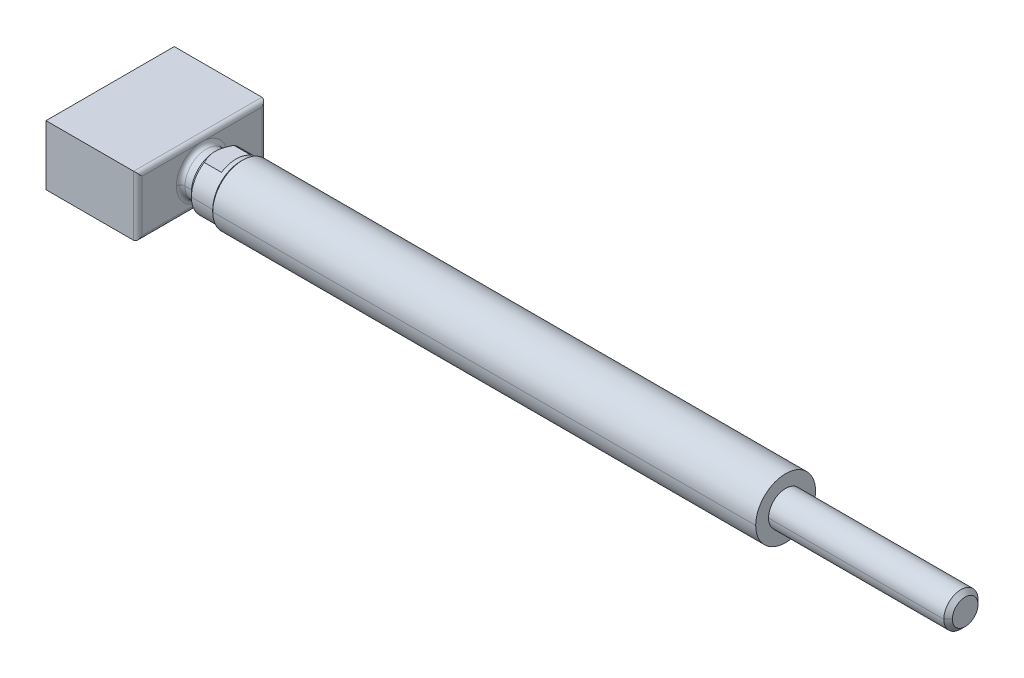
ISO-10303-21;
HEADER;
FILE_DESCRIPTION(('STEP AP214'),'2;1');
FILE_NAME('part.step','',(''),(''),'','','');
FILE_SCHEMA(('AUTOMOTIVE_DESIGN { 1 0 10303 214 1 1 1 1 }'));
ENDSEC;
DATA;
#1=APPLICATION_CONTEXT('core data for automotive mechanical design processes');
#2=APPLICATION_PROTOCOL_DEFINITION('international standard','automotive_design',2000,#1);
#3=PRODUCT_CONTEXT('',#1,'mechanical');
#4=PRODUCT('Part','Part','',(#3));
#5=PRODUCT_RELATED_PRODUCT_CATEGORY('part','',(#4));
#6=PRODUCT_DEFINITION_FORMATION('','',#4);
#7=PRODUCT_DEFINITION_CONTEXT('part definition',#1,'design');
#8=PRODUCT_DEFINITION('design','',#6,#7);
#9=PRODUCT_DEFINITION_SHAPE('','',#8);
#10=(LENGTH_UNIT() NAMED_UNIT(*) SI_UNIT(.MILLI.,.METRE.));
#11=(NAMED_UNIT(*) PLANE_ANGLE_UNIT() SI_UNIT($,.RADIAN.));
#12=(NAMED_UNIT(*) SI_UNIT($,.STERADIAN.) SOLID_ANGLE_UNIT());
#13=UNCERTAINTY_MEASURE_WITH_UNIT(LENGTH_MEASURE(1.E-05),#10,'distance_accuracy_value','');
#14=(GEOMETRIC_REPRESENTATION_CONTEXT(3) GLOBAL_UNCERTAINTY_ASSIGNED_CONTEXT((#13)) GLOBAL_UNIT_ASSIGNED_CONTEXT((#10,
#11,#12)) REPRESENTATION_CONTEXT('',''));
#15=CARTESIAN_POINT('',(0.,0.,0.));
#16=DIRECTION('',(0.,0.,1.));
#17=DIRECTION('',(1.,0.,0.));
#18=AXIS2_PLACEMENT_3D('',#15,#16,#17);
#19=CARTESIAN_POINT('',(-77.5,0.,0.));
#20=DIRECTION('',(-1.,0.,0.));
#21=DIRECTION('',(0.,0.,1.));
#22=AXIS2_PLACEMENT_3D('',#19,#20,#21);
#23=TOROIDAL_SURFACE('',#22,6.,1.);
#24=CARTESIAN_POINT('',(-78.5,0.,0.));
#25=DIRECTION('',(-1.,0.,0.));
#26=DIRECTION('',(0.,0.,1.));
#27=AXIS2_PLACEMENT_3D('',#24,#25,#26);
#28=CIRCLE('',#27,6.);
#29=CARTESIAN_POINT('',(-78.5,0.,-6.));
#30=VERTEX_POINT('',#29);
#31=CARTESIAN_POINT('',(-78.5,-6.,0.));
#32=VERTEX_POINT('',#31);
#33=EDGE_CURVE('E538',#30,#32,#28,.T.);
#34=ORIENTED_EDGE('',*,*,#33,.F.);
#35=CARTESIAN_POINT('',(-77.5,0.,-6.));
#36=DIRECTION('',(0.,1.,0.));
#37=DIRECTION('',(0.,0.,1.));
#38=AXIS2_PLACEMENT_3D('',#35,#36,#37);
#39=CIRCLE('',#38,1.);
#40=CARTESIAN_POINT('',(-77.5,0.,-5.));
#41=VERTEX_POINT('',#40);
#42=EDGE_CURVE('E550',#30,#41,#39,.T.);
#43=ORIENTED_EDGE('',*,*,#42,.T.);
#44=CARTESIAN_POINT('',(-77.5,0.,0.));
#45=DIRECTION('',(1.,0.,0.));
#46=DIRECTION('',(0.,0.,1.));
#47=AXIS2_PLACEMENT_3D('',#44,#45,#46);
#48=CIRCLE('',#47,5.);
#49=CARTESIAN_POINT('',(-77.5,0.,5.));
#50=VERTEX_POINT('',#49);
#51=EDGE_CURVE('E440',#50,#41,#48,.T.);
#52=ORIENTED_EDGE('',*,*,#51,.F.);
#53=CARTESIAN_POINT('',(-77.5,0.,6.));
#54=DIRECTION('',(0.,-1.,0.));
#55=DIRECTION('',(0.,0.,-1.));
#56=AXIS2_PLACEMENT_3D('',#53,#54,#55);
#57=CIRCLE('',#56,1.);
#58=CARTESIAN_POINT('',(-78.5,0.,6.));
#59=VERTEX_POINT('',#58);
#60=EDGE_CURVE('E421',#59,#50,#57,.T.);
#61=ORIENTED_EDGE('',*,*,#60,.F.);
#62=CARTESIAN_POINT('',(-78.5,0.,0.));
#63=DIRECTION('',(-1.,0.,0.));
#64=DIRECTION('',(0.,0.,1.));
#65=AXIS2_PLACEMENT_3D('',#62,#63,#64);
#66=CIRCLE('',#65,6.);
#67=EDGE_CURVE('E486',#32,#59,#66,.T.);
#68=ORIENTED_EDGE('',*,*,#67,.F.);
#69=EDGE_LOOP('',(#34,#43,#52,#61,#68));
#70=FACE_BOUND('',#69,.T.);
#71=ADVANCED_FACE('F16',(#70),#23,.F.);
#72=CARTESIAN_POINT('',(-100.,0.,0.));
#73=DIRECTION('',(-1.,0.,0.));
#74=DIRECTION('',(0.,0.,1.));
#75=AXIS2_PLACEMENT_3D('',#72,#73,#74);
#76=CYLINDRICAL_SURFACE('',#75,5.);
#77=CARTESIAN_POINT('',(-75.5,0.,0.));
#78=DIRECTION('',(-1.,0.,0.));
#79=DIRECTION('',(0.,0.,1.));
#80=AXIS2_PLACEMENT_3D('',#77,#78,#79);
#81=CIRCLE('',#80,5.);
#82=CARTESIAN_POINT('',(-75.5,0.,5.));
#83=VERTEX_POINT('',#82);
#84=CARTESIAN_POINT('',(-75.5,0.,-5.));
#85=VERTEX_POINT('',#84);
#86=EDGE_CURVE('E220',#83,#85,#81,.T.);
#87=ORIENTED_EDGE('',*,*,#86,.T.);
#88=DIRECTION('',(-1.,0.,0.));
#89=VECTOR('',#88,1.);
#90=CARTESIAN_POINT('',(-100.,0.,-5.));
#91=LINE('',#90,#89);
#92=EDGE_CURVE('E516',#85,#41,#91,.T.);
#93=ORIENTED_EDGE('',*,*,#92,.T.);
#94=CARTESIAN_POINT('',(-77.5,0.,0.));
#95=DIRECTION('',(1.,0.,0.));
#96=DIRECTION('',(0.,0.,1.));
#97=AXIS2_PLACEMENT_3D('',#94,#95,#96);
#98=CIRCLE('',#97,5.);
#99=EDGE_CURVE('E460',#41,#50,#98,.T.);
#100=ORIENTED_EDGE('',*,*,#99,.T.);
#101=DIRECTION('',(-1.,0.,0.));
#102=VECTOR('',#101,1.);
#103=CARTESIAN_POINT('',(-100.,0.,5.));
#104=LINE('',#103,#102);
#105=EDGE_CURVE('E444',#83,#50,#104,.T.);
#106=ORIENTED_EDGE('',*,*,#105,.F.);
#107=EDGE_LOOP('',(#87,#93,#100,#106));
#108=FACE_BOUND('',#107,.T.);
#109=ADVANCED_FACE('F327',(#108),#76,.T.);
#110=CARTESIAN_POINT('',(-100.,0.,0.));
#111=DIRECTION('',(-1.,0.,0.));
#112=DIRECTION('',(0.,0.,1.));
#113=AXIS2_PLACEMENT_3D('',#110,#111,#112);
#114=CYLINDRICAL_SURFACE('',#113,6.5);
#115=CARTESIAN_POINT('',(-69.5,0.,0.));
#116=DIRECTION('',(-1.,0.,0.));
#117=DIRECTION('',(0.,0.,1.));
#118=AXIS2_PLACEMENT_3D('',#115,#116,#117);
#119=CIRCLE('',#118,6.5);
#120=CARTESIAN_POINT('',(-69.5,0.,6.5));
#121=VERTEX_POINT('',#120);
#122=CARTESIAN_POINT('',(-69.5,0.,-6.5));
#123=VERTEX_POINT('',#122);
#124=EDGE_CURVE('E11',#121,#123,#119,.T.);
#125=ORIENTED_EDGE('',*,*,#124,.T.);
#126=DIRECTION('',(-1.,0.,0.));
#127=VECTOR('',#126,1.);
#128=CARTESIAN_POINT('',(-100.,0.,-6.5));
#129=LINE('',#128,#127);
#130=CARTESIAN_POINT('',(-74.5,0.,-6.5));
#131=VERTEX_POINT('',#130);
#132=EDGE_CURVE('E499',#123,#131,#129,.T.);
#133=ORIENTED_EDGE('',*,*,#132,.T.);
#134=CARTESIAN_POINT('',(-74.5,0.,0.));
#135=DIRECTION('',(-1.,0.,0.));
#136=DIRECTION('',(0.,0.,1.));
#137=AXIS2_PLACEMENT_3D('',#134,#135,#136);
#138=CIRCLE('',#137,6.5);
#139=CARTESIAN_POINT('',(-74.5,5.5,-3.46410161513775));
#140=VERTEX_POINT('',#139);
#141=EDGE_CURVE('E541',#140,#131,#138,.T.);
#142=ORIENTED_EDGE('',*,*,#141,.F.);
#143=DIRECTION('',(1.,0.,0.));
#144=VECTOR('',#143,1.);
#145=CARTESIAN_POINT('',(-100.,5.5,-3.46410161513775));
#146=LINE('',#145,#144);
#147=CARTESIAN_POINT('',(-70.5,5.5,-3.46410161513775));
#148=VERTEX_POINT('',#147);
#149=EDGE_CURVE('E573',#140,#148,#146,.T.);
#150=ORIENTED_EDGE('',*,*,#149,.T.);
#151=CARTESIAN_POINT('',(-70.5,0.,0.));
#152=DIRECTION('',(1.,0.,0.));
#153=DIRECTION('',(0.,0.,-1.));
#154=AXIS2_PLACEMENT_3D('',#151,#152,#153);
#155=CIRCLE('',#154,6.5);
#156=CARTESIAN_POINT('',(-70.5,5.5,3.46410161513775));
#157=VERTEX_POINT('',#156);
#158=EDGE_CURVE('E483',#148,#157,#155,.T.);
#159=ORIENTED_EDGE('',*,*,#158,.T.);
#160=DIRECTION('',(-1.,0.,0.));
#161=VECTOR('',#160,1.);
#162=CARTESIAN_POINT('',(-100.,5.5,3.46410161513775));
#163=LINE('',#162,#161);
#164=CARTESIAN_POINT('',(-74.5,5.5,3.46410161513775));
#165=VERTEX_POINT('',#164);
#166=EDGE_CURVE('E250',#157,#165,#163,.T.);
#167=ORIENTED_EDGE('',*,*,#166,.T.);
#168=CARTESIAN_POINT('',(-74.5,0.,0.));
#169=DIRECTION('',(-1.,0.,0.));
#170=DIRECTION('',(0.,0.,1.));
#171=AXIS2_PLACEMENT_3D('',#168,#169,#170);
#172=CIRCLE('',#171,6.5);
#173=CARTESIAN_POINT('',(-74.5,0.,6.5));
#174=VERTEX_POINT('',#173);
#175=EDGE_CURVE('E219',#174,#165,#172,.T.);
#176=ORIENTED_EDGE('',*,*,#175,.F.);
#177=DIRECTION('',(-1.,0.,0.));
#178=VECTOR('',#177,1.);
#179=CARTESIAN_POINT('',(-100.,0.,6.5));
#180=LINE('',#179,#178);
#181=EDGE_CURVE('E216',#121,#174,#180,.T.);
#182=ORIENTED_EDGE('',*,*,#181,.F.);
#183=EDGE_LOOP('',(#125,#133,#142,#150,#159,#167,#176,#182));
#184=FACE_BOUND('',#183,.T.);
#185=ADVANCED_FACE('F323',(#184),#114,.T.);
#186=CARTESIAN_POINT('',(-69.,0.,0.));
#187=DIRECTION('',(1.,0.,0.));
#188=DIRECTION('',(0.,0.,-1.));
#189=AXIS2_PLACEMENT_3D('',#186,#187,#188);
#190=CONICAL_SURFACE('',#189,7.,0.785398163397446);
#191=ORIENTED_EDGE('',*,*,#124,.F.);
#192=DIRECTION('',(0.707106781186549,0.,0.707106781186546));
#193=VECTOR('',#192,1.);
#194=CARTESIAN_POINT('',(-69.,0.,7.));
#195=LINE('',#194,#193);
#196=CARTESIAN_POINT('',(-69.,0.,7.));
#197=VERTEX_POINT('',#196);
#198=EDGE_CURVE('E454',#121,#197,#195,.T.);
#199=ORIENTED_EDGE('',*,*,#198,.T.);
#200=CARTESIAN_POINT('',(-69.,0.,0.));
#201=DIRECTION('',(-1.,0.,0.));
#202=DIRECTION('',(0.,0.,1.));
#203=AXIS2_PLACEMENT_3D('',#200,#201,#202);
#204=CIRCLE('',#203,7.);
#205=CARTESIAN_POINT('',(-69.,0.,-7.));
#206=VERTEX_POINT('',#205);
#207=EDGE_CURVE('E33',#197,#206,#204,.T.);
#208=ORIENTED_EDGE('',*,*,#207,.T.);
#209=DIRECTION('',(0.707106781186549,0.,-0.707106781186546));
#210=VECTOR('',#209,1.);
#211=CARTESIAN_POINT('',(-69.,0.,-7.));
#212=LINE('',#211,#210);
#213=EDGE_CURVE('E449',#123,#206,#212,.T.);
#214=ORIENTED_EDGE('',*,*,#213,.F.);
#215=EDGE_LOOP('',(#191,#199,#208,#214));
#216=FACE_BOUND('',#215,.T.);
#217=ADVANCED_FACE('F326',(#216),#190,.T.);
#218=CARTESIAN_POINT('',(-100.,0.,0.));
#219=DIRECTION('',(-1.,0.,0.));
#220=DIRECTION('',(0.,0.,1.));
#221=AXIS2_PLACEMENT_3D('',#218,#219,#220);
#222=CYLINDRICAL_SURFACE('',#221,7.);
#223=CARTESIAN_POINT('',(58.,0.,0.));
#224=DIRECTION('',(-1.,0.,0.));
#225=DIRECTION('',(0.,0.,1.));
#226=AXIS2_PLACEMENT_3D('',#223,#224,#225);
#227=CIRCLE('',#226,7.);
#228=CARTESIAN_POINT('',(58.,0.,7.));
#229=VERTEX_POINT('',#228);
#230=CARTESIAN_POINT('',(58.,0.,-7.));
#231=VERTEX_POINT('',#230);
#232=EDGE_CURVE('E528',#229,#231,#227,.T.);
#233=ORIENTED_EDGE('',*,*,#232,.T.);
#234=DIRECTION('',(-1.,0.,0.));
#235=VECTOR('',#234,1.);
#236=CARTESIAN_POINT('',(-100.,0.,-7.));
#237=LINE('',#236,#235);
#238=EDGE_CURVE('E542',#231,#206,#237,.T.);
#239=ORIENTED_EDGE('',*,*,#238,.T.);
#240=ORIENTED_EDGE('',*,*,#207,.F.);
#241=DIRECTION('',(-1.,0.,0.));
#242=VECTOR('',#241,1.);
#243=CARTESIAN_POINT('',(-100.,0.,7.));
#244=LINE('',#243,#242);
#245=EDGE_CURVE('E524',#229,#197,#244,.T.);
#246=ORIENTED_EDGE('',*,*,#245,.F.);
#247=EDGE_LOOP('',(#233,#239,#240,#246));
#248=FACE_BOUND('',#247,.T.);
#249=ADVANCED_FACE('F317',(#248),#222,.T.);
#250=CARTESIAN_POINT('',(-100.,0.,0.));
#251=DIRECTION('',(-1.,0.,0.));
#252=DIRECTION('',(0.,0.,1.));
#253=AXIS2_PLACEMENT_3D('',#250,#251,#252);
#254=CYLINDRICAL_SURFACE('',#253,4.);
#255=CARTESIAN_POINT('',(99.,0.,0.));
#256=DIRECTION('',(-1.,0.,0.));
#257=DIRECTION('',(0.,0.,1.));
#258=AXIS2_PLACEMENT_3D('',#255,#256,#257);
#259=CIRCLE('',#258,4.);
#260=CARTESIAN_POINT('',(99.,0.,4.));
#261=VERTEX_POINT('',#260);
#262=CARTESIAN_POINT('',(99.,0.,-4.));
#263=VERTEX_POINT('',#262);
#264=EDGE_CURVE('E476',#261,#263,#259,.T.);
#265=ORIENTED_EDGE('',*,*,#264,.T.);
#266=DIRECTION('',(-1.,0.,0.));
#267=VECTOR('',#266,1.);
#268=CARTESIAN_POINT('',(-100.,0.,-4.));
#269=LINE('',#268,#267);
#270=CARTESIAN_POINT('',(58.,0.,-4.));
#271=VERTEX_POINT('',#270);
#272=EDGE_CURVE('E472',#263,#271,#269,.T.);
#273=ORIENTED_EDGE('',*,*,#272,.T.);
#274=CARTESIAN_POINT('',(58.,0.,0.));
#275=DIRECTION('',(-1.,0.,0.));
#276=DIRECTION('',(0.,0.,1.));
#277=AXIS2_PLACEMENT_3D('',#274,#275,#276);
#278=CIRCLE('',#277,4.);
#279=CARTESIAN_POINT('',(58.,0.,4.));
#280=VERTEX_POINT('',#279);
#281=EDGE_CURVE('E534',#280,#271,#278,.T.);
#282=ORIENTED_EDGE('',*,*,#281,.F.);
#283=DIRECTION('',(-1.,0.,0.));
#284=VECTOR('',#283,1.);
#285=CARTESIAN_POINT('',(-100.,0.,4.));
#286=LINE('',#285,#284);
#287=EDGE_CURVE('E471',#261,#280,#286,.T.);
#288=ORIENTED_EDGE('',*,*,#287,.F.);
#289=EDGE_LOOP('',(#265,#273,#282,#288));
#290=FACE_BOUND('',#289,.T.);
#291=ADVANCED_FACE('F269',(#290),#254,.T.);
#292=CARTESIAN_POINT('',(100.,0.,0.));
#293=DIRECTION('',(-1.,0.,0.));
#294=DIRECTION('',(0.,0.,1.));
#295=AXIS2_PLACEMENT_3D('',#292,#293,#294);
#296=CONICAL_SURFACE('',#295,3.,0.785398163397448);
#297=CARTESIAN_POINT('',(100.,0.,0.));
#298=DIRECTION('',(-1.,0.,0.));
#299=DIRECTION('',(0.,0.,1.));
#300=AXIS2_PLACEMENT_3D('',#297,#298,#299);
#301=CIRCLE('',#300,3.);
#302=CARTESIAN_POINT('',(100.,0.,3.));
#303=VERTEX_POINT('',#302);
#304=CARTESIAN_POINT('',(100.,0.,-3.));
#305=VERTEX_POINT('',#304);
#306=EDGE_CURVE('E47',#303,#305,#301,.T.);
#307=ORIENTED_EDGE('',*,*,#306,.T.);
#308=DIRECTION('',(-0.707106781186548,0.,-0.707106781186547));
#309=VECTOR('',#308,1.);
#310=CARTESIAN_POINT('',(100.,0.,-3.));
#311=LINE('',#310,#309);
#312=EDGE_CURVE('E549',#305,#263,#311,.T.);
#313=ORIENTED_EDGE('',*,*,#312,.T.);
#314=ORIENTED_EDGE('',*,*,#264,.F.);
#315=DIRECTION('',(-0.707106781186548,0.,0.707106781186547));
#316=VECTOR('',#315,1.);
#317=CARTESIAN_POINT('',(100.,0.,3.));
#318=LINE('',#317,#316);
#319=EDGE_CURVE('E502',#303,#261,#318,.T.);
#320=ORIENTED_EDGE('',*,*,#319,.F.);
#321=EDGE_LOOP('',(#307,#313,#314,#320));
#322=FACE_BOUND('',#321,.T.);
#323=ADVANCED_FACE('F264',(#322),#296,.T.);
#324=CARTESIAN_POINT('',(-74.5,0.,0.));
#325=DIRECTION('',(1.,0.,0.));
#326=DIRECTION('',(0.,0.,-1.));
#327=AXIS2_PLACEMENT_3D('',#324,#325,#326);
#328=CONICAL_SURFACE('',#327,6.5,0.785398163397448);
#329=CARTESIAN_POINT('',(-75.5,0.,0.));
#330=DIRECTION('',(-1.,0.,0.));
#331=DIRECTION('',(0.,0.,1.));
#332=AXIS2_PLACEMENT_3D('',#329,#330,#331);
#333=CIRCLE('',#332,5.5);
#334=CARTESIAN_POINT('',(-75.5,0.,-5.5));
#335=VERTEX_POINT('',#334);
#336=CARTESIAN_POINT('',(-75.5,-5.5,0.));
#337=VERTEX_POINT('',#336);
#338=EDGE_CURVE('E566',#335,#337,#333,.T.);
#339=ORIENTED_EDGE('',*,*,#338,.F.);
#340=DIRECTION('',(0.707106781186548,0.,-0.707106781186547));
#341=VECTOR('',#340,1.);
#342=CARTESIAN_POINT('',(-74.5,0.,-6.5));
#343=LINE('',#342,#341);
#344=EDGE_CURVE('E511',#335,#131,#343,.T.);
#345=ORIENTED_EDGE('',*,*,#344,.T.);
#346=CARTESIAN_POINT('',(-74.5,0.,0.));
#347=DIRECTION('',(-1.,0.,0.));
#348=DIRECTION('',(0.,0.,1.));
#349=AXIS2_PLACEMENT_3D('',#346,#347,#348);
#350=CIRCLE('',#349,6.5);
#351=CARTESIAN_POINT('',(-74.5,-5.5,-3.46410161513775));
#352=VERTEX_POINT('',#351);
#353=EDGE_CURVE('E447',#131,#352,#350,.T.);
#354=ORIENTED_EDGE('',*,*,#353,.T.);
#355=CARTESIAN_POINT('',(-74.5,-5.5,-3.46410161513775));
#356=CARTESIAN_POINT('',(-74.5520670063043,-5.5,-3.36639231048485));
#357=CARTESIAN_POINT('',(-74.602914573613,-5.5,-3.26803477504346));
#358=CARTESIAN_POINT('',(-74.7018354319516,-5.5,-3.06989646737792));
#359=CARTESIAN_POINT('',(-74.7499078198237,-5.5,-2.97011524485662));
#360=CARTESIAN_POINT('',(-74.8897889742277,-5.5,-2.66772032538694));
#361=CARTESIAN_POINT('',(-74.9768305432994,-5.5,-2.46285195615751));
#362=CARTESIAN_POINT('',(-75.1326212757393,-5.5,-2.05214101589369));
#363=CARTESIAN_POINT('',(-75.2017787338366,-5.5,-1.84645521756863));
#364=CARTESIAN_POINT('',(-75.3206703988509,-5.5,-1.4298497791996));
#365=CARTESIAN_POINT('',(-75.3704425313218,-5.5,-1.21894122602478));
#366=CARTESIAN_POINT('',(-75.4384694427188,-5.5,-0.840833175891037));
#367=CARTESIAN_POINT('',(-75.4612936697113,-5.5,-0.674463828044059));
#368=CARTESIAN_POINT('',(-75.4843908290548,-5.5,-0.423098145503098));
#369=CARTESIAN_POINT('',(-75.4902341434836,-5.5,-0.338591444805933));
#370=CARTESIAN_POINT('',(-75.4980426172977,-5.5,-0.169393495526894));
#371=CARTESIAN_POINT('',(-75.5000075013453,-5.5,-0.0847022342699308));
#372=CARTESIAN_POINT('',(-75.5,-5.5,0.));
#373=B_SPLINE_CURVE_WITH_KNOTS('',3,(#355,#356,#357,#358,#359,#360,#361,#362,#363,#364,#365,
#366,#367,#368,#369,#370,#371,#372),.UNSPECIFIED.,.F.,.F.,(4,2,2,2,2,2,2,2,4),(0.,
0.332131746596437,0.664370980166019,1.33156261056564,1.98181606925445,2.6307909005797,
3.13390574239053,3.38795081114665,3.6420139144342),.UNSPECIFIED.);
#374=EDGE_CURVE('E227',#352,#337,#373,.T.);
#375=ORIENTED_EDGE('',*,*,#374,.T.);
#376=EDGE_LOOP('',(#339,#345,#354,#375));
#377=FACE_BOUND('',#376,.T.);
#378=ADVANCED_FACE('F268',(#377),#328,.T.);
#379=CARTESIAN_POINT('',(-78.5,5.,0.));
#380=DIRECTION('',(-1.,0.,0.));
#381=DIRECTION('',(0.,0.,1.));
#382=AXIS2_PLACEMENT_3D('',#379,#380,#381);
#383=PLANE('',#382);
#384=DIRECTION('',(0.,1.,0.));
#385=VECTOR('',#384,1.);
#386=CARTESIAN_POINT('',(-78.5,7.,-14.));
#387=LINE('',#386,#385);
#388=CARTESIAN_POINT('',(-78.5,-6.,-14.));
#389=VERTEX_POINT('',#388);
#390=CARTESIAN_POINT('',(-78.5,6.,-14.));
#391=VERTEX_POINT('',#390);
#392=EDGE_CURVE('E482',#389,#391,#387,.T.);
#393=ORIENTED_EDGE('',*,*,#392,.T.);
#394=DIRECTION('',(0.,0.,1.));
#395=VECTOR('',#394,1.);
#396=CARTESIAN_POINT('',(-78.5,6.,15.));
#397=LINE('',#396,#395);
#398=CARTESIAN_POINT('',(-78.5,6.,0.));
#399=VERTEX_POINT('',#398);
#400=EDGE_CURVE('E409',#391,#399,#397,.T.);
#401=ORIENTED_EDGE('',*,*,#400,.T.);
#402=CARTESIAN_POINT('',(-78.5,0.,0.));
#403=DIRECTION('',(-1.,0.,0.));
#404=DIRECTION('',(0.,0.,1.));
#405=AXIS2_PLACEMENT_3D('',#402,#403,#404);
#406=CIRCLE('',#405,6.);
#407=EDGE_CURVE('E554',#399,#30,#406,.T.);
#408=ORIENTED_EDGE('',*,*,#407,.T.);
#409=ORIENTED_EDGE('',*,*,#33,.T.);
#410=DIRECTION('',(0.,0.,-1.));
#411=VECTOR('',#410,1.);
#412=CARTESIAN_POINT('',(-78.5,-6.,-15.));
#413=LINE('',#412,#411);
#414=EDGE_CURVE('E481',#32,#389,#413,.T.);
#415=ORIENTED_EDGE('',*,*,#414,.T.);
#416=EDGE_LOOP('',(#393,#401,#408,#409,#415));
#417=FACE_BOUND('',#416,.T.);
#418=ADVANCED_FACE('F347',(#417),#383,.F.);
#419=CARTESIAN_POINT('',(-74.5,0.,0.));
#420=DIRECTION('',(1.,0.,0.));
#421=DIRECTION('',(0.,0.,-1.));
#422=AXIS2_PLACEMENT_3D('',#419,#420,#421);
#423=CONICAL_SURFACE('',#422,6.5,0.785398163397448);
#424=ORIENTED_EDGE('',*,*,#344,.F.);
#425=CARTESIAN_POINT('',(-75.5,0.,0.));
#426=DIRECTION('',(-1.,0.,0.));
#427=DIRECTION('',(0.,0.,1.));
#428=AXIS2_PLACEMENT_3D('',#425,#426,#427);
#429=CIRCLE('',#428,5.5);
#430=CARTESIAN_POINT('',(-75.5,5.5,0.));
#431=VERTEX_POINT('',#430);
#432=EDGE_CURVE('E443',#431,#335,#429,.T.);
#433=ORIENTED_EDGE('',*,*,#432,.F.);
#434=CARTESIAN_POINT('',(-75.5,5.5,0.));
#435=CARTESIAN_POINT('',(-75.5000067814901,5.5,-0.0845024363328521));
#436=CARTESIAN_POINT('',(-75.4980515717066,5.5,-0.168992270115319));
#437=CARTESIAN_POINT('',(-75.4902810080754,5.5,-0.337781227576544));
#438=CARTESIAN_POINT('',(-75.4844662670954,5.5,-0.422080379402131));
#439=CARTESIAN_POINT('',(-75.4613590225216,5.5,-0.674140359222897));
#440=CARTESIAN_POINT('',(-75.438402974733,5.5,-0.841409941455972));
#441=CARTESIAN_POINT('',(-75.3790706584935,5.5,-1.17077816997709));
#442=CARTESIAN_POINT('',(-75.342910391959,5.5,-1.33291677161127));
#443=CARTESIAN_POINT('',(-75.2587383984197,5.5,-1.6541236229531));
#444=CARTESIAN_POINT('',(-75.2107223195704,5.5,-1.81319072205356));
#445=CARTESIAN_POINT('',(-75.1144252279604,5.5,-2.0987049839779));
#446=CARTESIAN_POINT('',(-75.067842705042,5.5,-2.22573383883002));
#447=CARTESIAN_POINT('',(-74.9688676200951,5.5,-2.47748844482364));
#448=CARTESIAN_POINT('',(-74.9164755156495,5.5,-2.60221437645002));
#449=CARTESIAN_POINT('',(-74.8059583536269,5.5,-2.85109955016192));
#450=CARTESIAN_POINT('',(-74.7477655516056,5.5,-2.97522850343496));
#451=CARTESIAN_POINT('',(-74.6269952594492,5.5,-3.22127572386168));
#452=CARTESIAN_POINT('',(-74.5644195932319,5.5,-3.34319488433789));
#453=CARTESIAN_POINT('',(-74.5,5.5,-3.46410161513775));
#454=B_SPLINE_CURVE_WITH_KNOTS('',3,(#434,#435,#436,#437,#438,#439,#440,#441,#442,#443,#444,
#445,#446,#447,#448,#449,#450,#451,#452,#453),.UNSPECIFIED.,.F.,.F.,(4,2,2,2,2,2,2,2,2,4),(0.,
0.253460599446802,0.506880960669017,1.01268690060144,1.51056434932942,2.00862482344103,
2.41437502517772,2.82009329128062,3.23127917720927,3.6422949543544),.UNSPECIFIED.);
#455=EDGE_CURVE('E251',#431,#140,#454,.T.);
#456=ORIENTED_EDGE('',*,*,#455,.T.);
#457=ORIENTED_EDGE('',*,*,#141,.T.);
#458=EDGE_LOOP('',(#424,#433,#456,#457));
#459=FACE_BOUND('',#458,.T.);
#460=ADVANCED_FACE('F275',(#459),#423,.T.);
#461=CARTESIAN_POINT('',(100.,0.,0.));
#462=DIRECTION('',(-1.,0.,0.));
#463=DIRECTION('',(0.,0.,1.));
#464=AXIS2_PLACEMENT_3D('',#461,#462,#463);
#465=PLANE('',#464);
#466=ORIENTED_EDGE('',*,*,#306,.F.);
#467=CARTESIAN_POINT('',(100.,0.,0.));
#468=DIRECTION('',(-1.,0.,0.));
#469=DIRECTION('',(0.,0.,1.));
#470=AXIS2_PLACEMENT_3D('',#467,#468,#469);
#471=CIRCLE('',#470,3.);
#472=EDGE_CURVE('E506',#305,#303,#471,.T.);
#473=ORIENTED_EDGE('',*,*,#472,.F.);
#474=EDGE_LOOP('',(#466,#473));
#475=FACE_BOUND('',#474,.T.);
#476=ADVANCED_FACE('F271',(#475),#465,.F.);
#477=CARTESIAN_POINT('',(100.,0.,0.));
#478=DIRECTION('',(-1.,0.,0.));
#479=DIRECTION('',(0.,0.,1.));
#480=AXIS2_PLACEMENT_3D('',#477,#478,#479);
#481=CONICAL_SURFACE('',#480,3.,0.785398163397448);
#482=ORIENTED_EDGE('',*,*,#312,.F.);
#483=ORIENTED_EDGE('',*,*,#472,.T.);
#484=ORIENTED_EDGE('',*,*,#319,.T.);
#485=CARTESIAN_POINT('',(99.,0.,0.));
#486=DIRECTION('',(-1.,0.,0.));
#487=DIRECTION('',(0.,0.,1.));
#488=AXIS2_PLACEMENT_3D('',#485,#486,#487);
#489=CIRCLE('',#488,4.);
#490=EDGE_CURVE('E467',#263,#261,#489,.T.);
#491=ORIENTED_EDGE('',*,*,#490,.F.);
#492=EDGE_LOOP('',(#482,#483,#484,#491));
#493=FACE_BOUND('',#492,.T.);
#494=ADVANCED_FACE('F274',(#493),#481,.T.);
#495=CARTESIAN_POINT('',(-100.,0.,0.));
#496=DIRECTION('',(-1.,0.,0.));
#497=DIRECTION('',(0.,0.,1.));
#498=AXIS2_PLACEMENT_3D('',#495,#496,#497);
#499=CYLINDRICAL_SURFACE('',#498,4.);
#500=ORIENTED_EDGE('',*,*,#272,.F.);
#501=ORIENTED_EDGE('',*,*,#490,.T.);
#502=ORIENTED_EDGE('',*,*,#287,.T.);
#503=CARTESIAN_POINT('',(58.,0.,0.));
#504=DIRECTION('',(-1.,0.,0.));
#505=DIRECTION('',(0.,0.,1.));
#506=AXIS2_PLACEMENT_3D('',#503,#504,#505);
#507=CIRCLE('',#506,4.);
#508=EDGE_CURVE('E530',#271,#280,#507,.T.);
#509=ORIENTED_EDGE('',*,*,#508,.F.);
#510=EDGE_LOOP('',(#500,#501,#502,#509));
#511=FACE_BOUND('',#510,.T.);
#512=ADVANCED_FACE('F18',(#511),#499,.T.);
#513=CARTESIAN_POINT('',(58.,4.,0.));
#514=DIRECTION('',(-1.,0.,0.));
#515=DIRECTION('',(0.,0.,1.));
#516=AXIS2_PLACEMENT_3D('',#513,#514,#515);
#517=PLANE('',#516);
#518=ORIENTED_EDGE('',*,*,#281,.T.);
#519=ORIENTED_EDGE('',*,*,#508,.T.);
#520=EDGE_LOOP('',(#518,#519));
#521=FACE_BOUND('',#520,.T.);
#522=ORIENTED_EDGE('',*,*,#232,.F.);
#523=CARTESIAN_POINT('',(58.,0.,0.));
#524=DIRECTION('',(-1.,0.,0.));
#525=DIRECTION('',(0.,0.,1.));
#526=AXIS2_PLACEMENT_3D('',#523,#524,#525);
#527=CIRCLE('',#526,7.);
#528=EDGE_CURVE('E529',#231,#229,#527,.T.);
#529=ORIENTED_EDGE('',*,*,#528,.F.);
#530=EDGE_LOOP('',(#522,#529));
#531=FACE_BOUND('',#530,.T.);
#532=ADVANCED_FACE('F310',(#521,#531),#517,.F.);
#533=CARTESIAN_POINT('',(-100.,0.,0.));
#534=DIRECTION('',(-1.,0.,0.));
#535=DIRECTION('',(0.,0.,1.));
#536=AXIS2_PLACEMENT_3D('',#533,#534,#535);
#537=CYLINDRICAL_SURFACE('',#536,7.);
#538=ORIENTED_EDGE('',*,*,#238,.F.);
#539=ORIENTED_EDGE('',*,*,#528,.T.);
#540=ORIENTED_EDGE('',*,*,#245,.T.);
#541=CARTESIAN_POINT('',(-69.,0.,0.));
#542=DIRECTION('',(-1.,0.,0.));
#543=DIRECTION('',(0.,0.,1.));
#544=AXIS2_PLACEMENT_3D('',#541,#542,#543);
#545=CIRCLE('',#544,7.);
#546=EDGE_CURVE('E453',#206,#197,#545,.T.);
#547=ORIENTED_EDGE('',*,*,#546,.F.);
#548=EDGE_LOOP('',(#538,#539,#540,#547));
#549=FACE_BOUND('',#548,.T.);
#550=ADVANCED_FACE('F313',(#549),#537,.T.);
#551=CARTESIAN_POINT('',(-69.,0.,0.));
#552=DIRECTION('',(1.,0.,0.));
#553=DIRECTION('',(0.,0.,-1.));
#554=AXIS2_PLACEMENT_3D('',#551,#552,#553);
#555=CONICAL_SURFACE('',#554,7.,0.785398163397446);
#556=ORIENTED_EDGE('',*,*,#198,.F.);
#557=CARTESIAN_POINT('',(-69.5,0.,0.));
#558=DIRECTION('',(-1.,0.,0.));
#559=DIRECTION('',(0.,0.,1.));
#560=AXIS2_PLACEMENT_3D('',#557,#558,#559);
#561=CIRCLE('',#560,6.5);
#562=EDGE_CURVE('E448',#123,#121,#561,.T.);
#563=ORIENTED_EDGE('',*,*,#562,.F.);
#564=ORIENTED_EDGE('',*,*,#213,.T.);
#565=ORIENTED_EDGE('',*,*,#546,.T.);
#566=EDGE_LOOP('',(#556,#563,#564,#565));
#567=FACE_BOUND('',#566,.T.);
#568=ADVANCED_FACE('F293',(#567),#555,.T.);
#569=CARTESIAN_POINT('',(-100.,0.,0.));
#570=DIRECTION('',(-1.,0.,0.));
#571=DIRECTION('',(0.,0.,1.));
#572=AXIS2_PLACEMENT_3D('',#569,#570,#571);
#573=CYLINDRICAL_SURFACE('',#572,6.5);
#574=ORIENTED_EDGE('',*,*,#132,.F.);
#575=ORIENTED_EDGE('',*,*,#562,.T.);
#576=ORIENTED_EDGE('',*,*,#181,.T.);
#577=CARTESIAN_POINT('',(-74.5,0.,0.));
#578=DIRECTION('',(-1.,0.,0.));
#579=DIRECTION('',(0.,0.,1.));
#580=AXIS2_PLACEMENT_3D('',#577,#578,#579);
#581=CIRCLE('',#580,6.5);
#582=CARTESIAN_POINT('',(-74.5,-5.5,3.46410161513775));
#583=VERTEX_POINT('',#582);
#584=EDGE_CURVE('E208',#583,#174,#581,.T.);
#585=ORIENTED_EDGE('',*,*,#584,.F.);
#586=DIRECTION('',(1.,0.,0.));
#587=VECTOR('',#586,1.);
#588=CARTESIAN_POINT('',(-100.,-5.5,3.46410161513775));
#589=LINE('',#588,#587);
#590=CARTESIAN_POINT('',(-70.5,-5.5,3.46410161513775));
#591=VERTEX_POINT('',#590);
#592=EDGE_CURVE('E212',#583,#591,#589,.T.);
#593=ORIENTED_EDGE('',*,*,#592,.T.);
#594=CARTESIAN_POINT('',(-70.5,0.,0.));
#595=DIRECTION('',(1.,0.,0.));
#596=DIRECTION('',(0.,0.,-1.));
#597=AXIS2_PLACEMENT_3D('',#594,#595,#596);
#598=CIRCLE('',#597,6.5);
#599=CARTESIAN_POINT('',(-70.5,-5.5,-3.46410161513775));
#600=VERTEX_POINT('',#599);
#601=EDGE_CURVE('E582',#591,#600,#598,.T.);
#602=ORIENTED_EDGE('',*,*,#601,.T.);
#603=DIRECTION('',(-1.,0.,0.));
#604=VECTOR('',#603,1.);
#605=CARTESIAN_POINT('',(-100.,-5.5,-3.46410161513775));
#606=LINE('',#605,#604);
#607=EDGE_CURVE('E379',#600,#352,#606,.T.);
#608=ORIENTED_EDGE('',*,*,#607,.T.);
#609=ORIENTED_EDGE('',*,*,#353,.F.);
#610=EDGE_LOOP('',(#574,#575,#576,#585,#593,#602,#608,#609));
#611=FACE_BOUND('',#610,.T.);
#612=ADVANCED_FACE('F210',(#611),#573,.T.);
#613=CARTESIAN_POINT('',(-74.5,0.,0.));
#614=DIRECTION('',(1.,0.,0.));
#615=DIRECTION('',(0.,0.,-1.));
#616=AXIS2_PLACEMENT_3D('',#613,#614,#615);
#617=CONICAL_SURFACE('',#616,6.5,0.785398163397448);
#618=CARTESIAN_POINT('',(-75.5,0.,0.));
#619=DIRECTION('',(-1.,0.,0.));
#620=DIRECTION('',(0.,0.,1.));
#621=AXIS2_PLACEMENT_3D('',#618,#619,#620);
#622=CIRCLE('',#621,5.5);
#623=EDGE_CURVE('E198',#337,#431,#622,.T.);
#624=ORIENTED_EDGE('',*,*,#623,.F.);
#625=CARTESIAN_POINT('',(-75.5,-5.5,0.));
#626=CARTESIAN_POINT('',(-75.5000067814901,-5.5,0.0845024363328521));
#627=CARTESIAN_POINT('',(-75.4980515717066,-5.5,0.168992270115319));
#628=CARTESIAN_POINT('',(-75.4902810080754,-5.5,0.337781227576544));
#629=CARTESIAN_POINT('',(-75.4844662670954,-5.5,0.422080379402131));
#630=CARTESIAN_POINT('',(-75.4613590225216,-5.5,0.674140359222897));
#631=CARTESIAN_POINT('',(-75.438402974733,-5.5,0.841409941455972));
#632=CARTESIAN_POINT('',(-75.3790706584935,-5.5,1.17077816997709));
#633=CARTESIAN_POINT('',(-75.342910391959,-5.5,1.33291677161127));
#634=CARTESIAN_POINT('',(-75.2587383984197,-5.5,1.6541236229531));
#635=CARTESIAN_POINT('',(-75.2107223195704,-5.5,1.81319072205356));
#636=CARTESIAN_POINT('',(-75.1144252279604,-5.5,2.0987049839779));
#637=CARTESIAN_POINT('',(-75.067842705042,-5.5,2.22573383883002));
#638=CARTESIAN_POINT('',(-74.9688676200951,-5.5,2.47748844482364));
#639=CARTESIAN_POINT('',(-74.9164755156495,-5.5,2.60221437645002));
#640=CARTESIAN_POINT('',(-74.8059583536269,-5.5,2.85109955016192));
#641=CARTESIAN_POINT('',(-74.7477655516056,-5.5,2.97522850343496));
#642=CARTESIAN_POINT('',(-74.6269952594492,-5.5,3.22127572386168));
#643=CARTESIAN_POINT('',(-74.5644195932319,-5.5,3.34319488433789));
#644=CARTESIAN_POINT('',(-74.5,-5.5,3.46410161513775));
#645=B_SPLINE_CURVE_WITH_KNOTS('',3,(#625,#626,#627,#628,#629,#630,#631,#632,#633,#634,#635,
#636,#637,#638,#639,#640,#641,#642,#643,#644),.UNSPECIFIED.,.F.,.F.,(4,2,2,2,2,2,2,2,2,4),(0.,
0.253460599446802,0.506880960669017,1.01268690060144,1.51056434932942,2.00862482344103,
2.41437502517772,2.82009329128062,3.23127917720927,3.6422949543544),.UNSPECIFIED.);
#646=EDGE_CURVE('E20',#337,#583,#645,.T.);
#647=ORIENTED_EDGE('',*,*,#646,.T.);
#648=ORIENTED_EDGE('',*,*,#584,.T.);
#649=ORIENTED_EDGE('',*,*,#175,.T.);
#650=CARTESIAN_POINT('',(-74.5,5.5,3.46410161513775));
#651=CARTESIAN_POINT('',(-74.5520670063043,5.5,3.36639231048485));
#652=CARTESIAN_POINT('',(-74.602914573613,5.5,3.26803477504346));
#653=CARTESIAN_POINT('',(-74.7018354319516,5.5,3.06989646737792));
#654=CARTESIAN_POINT('',(-74.7499078198237,5.5,2.97011524485662));
#655=CARTESIAN_POINT('',(-74.8897889742277,5.5,2.66772032538694));
#656=CARTESIAN_POINT('',(-74.9768305432994,5.5,2.46285195615751));
#657=CARTESIAN_POINT('',(-75.1326212757393,5.5,2.05214101589369));
#658=CARTESIAN_POINT('',(-75.2017787338366,5.5,1.84645521756863));
#659=CARTESIAN_POINT('',(-75.3206703988509,5.5,1.4298497791996));
#660=CARTESIAN_POINT('',(-75.3704425313218,5.5,1.21894122602478));
#661=CARTESIAN_POINT('',(-75.4384694427188,5.5,0.840833175891037));
#662=CARTESIAN_POINT('',(-75.4612936697113,5.5,0.674463828044059));
#663=CARTESIAN_POINT('',(-75.4843908290548,5.5,0.423098145503098));
#664=CARTESIAN_POINT('',(-75.4902341434836,5.5,0.338591444805933));
#665=CARTESIAN_POINT('',(-75.4980426172977,5.5,0.169393495526894));
#666=CARTESIAN_POINT('',(-75.5000075013453,5.5,0.0847022342699308));
#667=CARTESIAN_POINT('',(-75.5,5.5,0.));
#668=B_SPLINE_CURVE_WITH_KNOTS('',3,(#650,#651,#652,#653,#654,#655,#656,#657,#658,#659,#660,
#661,#662,#663,#664,#665,#666,#667),.UNSPECIFIED.,.F.,.F.,(4,2,2,2,2,2,2,2,4),(0.,
0.332131746596437,0.664370980166019,1.33156261056564,1.98181606925445,2.6307909005797,
3.13390574239053,3.38795081114665,3.6420139144342),.UNSPECIFIED.);
#669=EDGE_CURVE('E242',#165,#431,#668,.T.);
#670=ORIENTED_EDGE('',*,*,#669,.T.);
#671=EDGE_LOOP('',(#624,#647,#648,#649,#670));
#672=FACE_BOUND('',#671,.T.);
#673=ADVANCED_FACE('F223',(#672),#617,.T.);
#674=CARTESIAN_POINT('',(-75.5,5.5,0.));
#675=DIRECTION('',(1.,0.,0.));
#676=DIRECTION('',(0.,1.,0.));
#677=AXIS2_PLACEMENT_3D('',#674,#675,#676);
#678=PLANE('',#677);
#679=ORIENTED_EDGE('',*,*,#86,.F.);
#680=CARTESIAN_POINT('',(-75.5,0.,0.));
#681=DIRECTION('',(-1.,0.,0.));
#682=DIRECTION('',(0.,0.,1.));
#683=AXIS2_PLACEMENT_3D('',#680,#681,#682);
#684=CIRCLE('',#683,5.);
#685=EDGE_CURVE('E512',#85,#83,#684,.T.);
#686=ORIENTED_EDGE('',*,*,#685,.F.);
#687=EDGE_LOOP('',(#679,#686));
#688=FACE_BOUND('',#687,.T.);
#689=ORIENTED_EDGE('',*,*,#432,.T.);
#690=ORIENTED_EDGE('',*,*,#338,.T.);
#691=ORIENTED_EDGE('',*,*,#623,.T.);
#692=EDGE_LOOP('',(#689,#690,#691));
#693=FACE_BOUND('',#692,.T.);
#694=ADVANCED_FACE('F263',(#688,#693),#678,.F.);
#695=CARTESIAN_POINT('',(-100.,0.,0.));
#696=DIRECTION('',(-1.,0.,0.));
#697=DIRECTION('',(0.,0.,1.));
#698=AXIS2_PLACEMENT_3D('',#695,#696,#697);
#699=CYLINDRICAL_SURFACE('',#698,5.);
#700=ORIENTED_EDGE('',*,*,#92,.F.);
#701=ORIENTED_EDGE('',*,*,#685,.T.);
#702=ORIENTED_EDGE('',*,*,#105,.T.);
#703=ORIENTED_EDGE('',*,*,#51,.T.);
#704=EDGE_LOOP('',(#700,#701,#702,#703));
#705=FACE_BOUND('',#704,.T.);
#706=ADVANCED_FACE('F283',(#705),#699,.T.);
#707=CARTESIAN_POINT('',(-78.5,5.,0.));
#708=DIRECTION('',(-1.,0.,0.));
#709=DIRECTION('',(0.,0.,1.));
#710=AXIS2_PLACEMENT_3D('',#707,#708,#709);
#711=PLANE('',#710);
#712=DIRECTION('',(0.,-1.,0.));
#713=VECTOR('',#712,1.);
#714=CARTESIAN_POINT('',(-78.5,-7.,14.));
#715=LINE('',#714,#713);
#716=CARTESIAN_POINT('',(-78.5,6.,14.));
#717=VERTEX_POINT('',#716);
#718=CARTESIAN_POINT('',(-78.5,-6.,14.));
#719=VERTEX_POINT('',#718);
#720=EDGE_CURVE('E390',#717,#719,#715,.T.);
#721=ORIENTED_EDGE('',*,*,#720,.T.);
#722=DIRECTION('',(0.,0.,-1.));
#723=VECTOR('',#722,1.);
#724=CARTESIAN_POINT('',(-78.5,-6.,-15.));
#725=LINE('',#724,#723);
#726=EDGE_CURVE('E393',#719,#32,#725,.T.);
#727=ORIENTED_EDGE('',*,*,#726,.T.);
#728=ORIENTED_EDGE('',*,*,#67,.T.);
#729=CARTESIAN_POINT('',(-78.5,0.,0.));
#730=DIRECTION('',(-1.,0.,0.));
#731=DIRECTION('',(0.,0.,1.));
#732=AXIS2_PLACEMENT_3D('',#729,#730,#731);
#733=CIRCLE('',#732,6.);
#734=EDGE_CURVE('E558',#59,#399,#733,.T.);
#735=ORIENTED_EDGE('',*,*,#734,.T.);
#736=DIRECTION('',(0.,0.,1.));
#737=VECTOR('',#736,1.);
#738=CARTESIAN_POINT('',(-78.5,6.,15.));
#739=LINE('',#738,#737);
#740=EDGE_CURVE('E397',#399,#717,#739,.T.);
#741=ORIENTED_EDGE('',*,*,#740,.T.);
#742=EDGE_LOOP('',(#721,#727,#728,#735,#741));
#743=FACE_BOUND('',#742,.T.);
#744=ADVANCED_FACE('F332',(#743),#711,.F.);
#745=CARTESIAN_POINT('',(-70.5,5.5,-20.));
#746=DIRECTION('',(1.,0.,0.));
#747=DIRECTION('',(0.,1.,0.));
#748=AXIS2_PLACEMENT_3D('',#745,#746,#747);
#749=PLANE('',#748);
#750=DIRECTION('',(0.,0.,1.));
#751=VECTOR('',#750,1.);
#752=CARTESIAN_POINT('',(-70.5,5.5,-20.));
#753=LINE('',#752,#751);
#754=EDGE_CURVE('E577',#148,#157,#753,.T.);
#755=ORIENTED_EDGE('',*,*,#754,.T.);
#756=ORIENTED_EDGE('',*,*,#158,.F.);
#757=EDGE_LOOP('',(#755,#756));
#758=FACE_BOUND('',#757,.T.);
#759=ADVANCED_FACE('F329',(#758),#749,.F.);
#760=CARTESIAN_POINT('',(-75.5,5.5,-20.));
#761=DIRECTION('',(0.,-1.,0.));
#762=DIRECTION('',(0.,0.,-1.));
#763=AXIS2_PLACEMENT_3D('',#760,#761,#762);
#764=PLANE('',#763);
#765=ORIENTED_EDGE('',*,*,#754,.F.);
#766=ORIENTED_EDGE('',*,*,#149,.F.);
#767=ORIENTED_EDGE('',*,*,#455,.F.);
#768=ORIENTED_EDGE('',*,*,#669,.F.);
#769=ORIENTED_EDGE('',*,*,#166,.F.);
#770=EDGE_LOOP('',(#765,#766,#767,#768,#769));
#771=FACE_BOUND('',#770,.T.);
#772=ADVANCED_FACE('F257',(#771),#764,.F.);
#773=CARTESIAN_POINT('',(-70.5,-5.5,-20.));
#774=DIRECTION('',(1.,0.,0.));
#775=DIRECTION('',(0.,1.,0.));
#776=AXIS2_PLACEMENT_3D('',#773,#774,#775);
#777=PLANE('',#776);
#778=DIRECTION('',(0.,0.,1.));
#779=VECTOR('',#778,1.);
#780=CARTESIAN_POINT('',(-70.5,-5.5,-20.));
#781=LINE('',#780,#779);
#782=EDGE_CURVE('E231',#600,#591,#781,.T.);
#783=ORIENTED_EDGE('',*,*,#782,.F.);
#784=ORIENTED_EDGE('',*,*,#601,.F.);
#785=EDGE_LOOP('',(#783,#784));
#786=FACE_BOUND('',#785,.T.);
#787=ADVANCED_FACE('F337',(#786),#777,.F.);
#788=CARTESIAN_POINT('',(-75.5,-5.5,-20.));
#789=DIRECTION('',(0.,1.,0.));
#790=DIRECTION('',(1.,0.,0.));
#791=AXIS2_PLACEMENT_3D('',#788,#789,#790);
#792=PLANE('',#791);
#793=ORIENTED_EDGE('',*,*,#782,.T.);
#794=ORIENTED_EDGE('',*,*,#592,.F.);
#795=ORIENTED_EDGE('',*,*,#646,.F.);
#796=ORIENTED_EDGE('',*,*,#374,.F.);
#797=ORIENTED_EDGE('',*,*,#607,.F.);
#798=EDGE_LOOP('',(#793,#794,#795,#796,#797));
#799=FACE_BOUND('',#798,.T.);
#800=ADVANCED_FACE('F228',(#799),#792,.F.);
#801=CARTESIAN_POINT('',(-45.3941092855063,-7.,15.));
#802=DIRECTION('',(0.,0.,1.));
#803=DIRECTION('',(1.,0.,0.));
#804=AXIS2_PLACEMENT_3D('',#801,#802,#803);
#805=PLANE('',#804);
#806=DIRECTION('',(-1.,0.,0.));
#807=VECTOR('',#806,1.);
#808=CARTESIAN_POINT('',(-45.3941092855063,-7.,15.));
#809=LINE('',#808,#807);
#810=CARTESIAN_POINT('',(-79.5,-7.,15.));
#811=VERTEX_POINT('',#810);
#812=CARTESIAN_POINT('',(-100.,-7.,15.));
#813=VERTEX_POINT('',#812);
#814=EDGE_CURVE('E238',#811,#813,#809,.T.);
#815=ORIENTED_EDGE('',*,*,#814,.F.);
#816=DIRECTION('',(0.,1.,0.));
#817=VECTOR('',#816,1.);
#818=CARTESIAN_POINT('',(-79.5,7.,15.));
#819=LINE('',#818,#817);
#820=CARTESIAN_POINT('',(-79.5,7.,15.));
#821=VERTEX_POINT('',#820);
#822=EDGE_CURVE('E401',#811,#821,#819,.T.);
#823=ORIENTED_EDGE('',*,*,#822,.T.);
#824=DIRECTION('',(-1.,0.,0.));
#825=VECTOR('',#824,1.);
#826=CARTESIAN_POINT('',(-45.3941092855063,7.,15.));
#827=LINE('',#826,#825);
#828=CARTESIAN_POINT('',(-100.,7.,15.));
#829=VERTEX_POINT('',#828);
#830=EDGE_CURVE('E466',#821,#829,#827,.T.);
#831=ORIENTED_EDGE('',*,*,#830,.T.);
#832=DIRECTION('',(0.,1.,0.));
#833=VECTOR('',#832,1.);
#834=CARTESIAN_POINT('',(-100.,-7.,15.));
#835=LINE('',#834,#833);
#836=EDGE_CURVE('E430',#813,#829,#835,.T.);
#837=ORIENTED_EDGE('',*,*,#836,.F.);
#838=EDGE_LOOP('',(#815,#823,#831,#837));
#839=FACE_BOUND('',#838,.T.);
#840=ADVANCED_FACE('F289',(#839),#805,.T.);
#841=CARTESIAN_POINT('',(-45.3941092855063,-7.,-15.));
#842=DIRECTION('',(0.,-1.,0.));
#843=DIRECTION('',(0.,0.,-1.));
#844=AXIS2_PLACEMENT_3D('',#841,#842,#843);
#845=PLANE('',#844);
#846=DIRECTION('',(-1.,0.,0.));
#847=VECTOR('',#846,1.);
#848=CARTESIAN_POINT('',(-45.3941092855063,-7.,-15.));
#849=LINE('',#848,#847);
#850=CARTESIAN_POINT('',(-79.5,-7.,-15.));
#851=VERTEX_POINT('',#850);
#852=CARTESIAN_POINT('',(-100.,-7.,-15.));
#853=VERTEX_POINT('',#852);
#854=EDGE_CURVE('E437',#851,#853,#849,.T.);
#855=ORIENTED_EDGE('',*,*,#854,.F.);
#856=DIRECTION('',(0.,0.,1.));
#857=VECTOR('',#856,1.);
#858=CARTESIAN_POINT('',(-79.5,-7.,15.));
#859=LINE('',#858,#857);
#860=EDGE_CURVE('E477',#851,#811,#859,.T.);
#861=ORIENTED_EDGE('',*,*,#860,.T.);
#862=ORIENTED_EDGE('',*,*,#814,.T.);
#863=DIRECTION('',(0.,0.,1.));
#864=VECTOR('',#863,1.);
#865=CARTESIAN_POINT('',(-100.,-7.,-15.));
#866=LINE('',#865,#864);
#867=EDGE_CURVE('E519',#853,#813,#866,.T.);
#868=ORIENTED_EDGE('',*,*,#867,.F.);
#869=EDGE_LOOP('',(#855,#861,#862,#868));
#870=FACE_BOUND('',#869,.T.);
#871=ADVANCED_FACE('F285',(#870),#845,.T.);
#872=CARTESIAN_POINT('',(-45.3941092855063,-7.,-15.));
#873=DIRECTION('',(0.,0.,-1.));
#874=DIRECTION('',(0.,-1.,0.));
#875=AXIS2_PLACEMENT_3D('',#872,#873,#874);
#876=PLANE('',#875);
#877=DIRECTION('',(-1.,0.,0.));
#878=VECTOR('',#877,1.);
#879=CARTESIAN_POINT('',(-45.3941092855063,7.,-15.));
#880=LINE('',#879,#878);
#881=CARTESIAN_POINT('',(-79.5,7.,-15.));
#882=VERTEX_POINT('',#881);
#883=CARTESIAN_POINT('',(-100.,7.,-15.));
#884=VERTEX_POINT('',#883);
#885=EDGE_CURVE('E439',#882,#884,#880,.T.);
#886=ORIENTED_EDGE('',*,*,#885,.F.);
#887=DIRECTION('',(0.,-1.,0.));
#888=VECTOR('',#887,1.);
#889=CARTESIAN_POINT('',(-79.5,-7.,-15.));
#890=LINE('',#889,#888);
#891=EDGE_CURVE('E489',#882,#851,#890,.T.);
#892=ORIENTED_EDGE('',*,*,#891,.T.);
#893=ORIENTED_EDGE('',*,*,#854,.T.);
#894=DIRECTION('',(0.,-1.,0.));
#895=VECTOR('',#894,1.);
#896=CARTESIAN_POINT('',(-100.,-7.,-15.));
#897=LINE('',#896,#895);
#898=EDGE_CURVE('E429',#884,#853,#897,.T.);
#899=ORIENTED_EDGE('',*,*,#898,.F.);
#900=EDGE_LOOP('',(#886,#892,#893,#899));
#901=FACE_BOUND('',#900,.T.);
#902=ADVANCED_FACE('F288',(#901),#876,.T.);
#903=CARTESIAN_POINT('',(-45.3941092855063,7.,-15.));
#904=DIRECTION('',(0.,1.,0.));
#905=DIRECTION('',(1.,0.,0.));
#906=AXIS2_PLACEMENT_3D('',#903,#904,#905);
#907=PLANE('',#906);
#908=ORIENTED_EDGE('',*,*,#830,.F.);
#909=DIRECTION('',(0.,0.,-1.));
#910=VECTOR('',#909,1.);
#911=CARTESIAN_POINT('',(-79.5,7.,-15.));
#912=LINE('',#911,#910);
#913=EDGE_CURVE('E431',#821,#882,#912,.T.);
#914=ORIENTED_EDGE('',*,*,#913,.T.);
#915=ORIENTED_EDGE('',*,*,#885,.T.);
#916=DIRECTION('',(0.,0.,-1.));
#917=VECTOR('',#916,1.);
#918=CARTESIAN_POINT('',(-100.,7.,-15.));
#919=LINE('',#918,#917);
#920=EDGE_CURVE('E423',#829,#884,#919,.T.);
#921=ORIENTED_EDGE('',*,*,#920,.F.);
#922=EDGE_LOOP('',(#908,#914,#915,#921));
#923=FACE_BOUND('',#922,.T.);
#924=ADVANCED_FACE('F305',(#923),#907,.T.);
#925=CARTESIAN_POINT('',(-100.,5.,0.));
#926=DIRECTION('',(1.,0.,0.));
#927=DIRECTION('',(0.,1.,0.));
#928=AXIS2_PLACEMENT_3D('',#925,#926,#927);
#929=PLANE('',#928);
#930=ORIENTED_EDGE('',*,*,#836,.T.);
#931=ORIENTED_EDGE('',*,*,#920,.T.);
#932=ORIENTED_EDGE('',*,*,#898,.T.);
#933=ORIENTED_EDGE('',*,*,#867,.T.);
#934=EDGE_LOOP('',(#930,#931,#932,#933));
#935=FACE_BOUND('',#934,.T.);
#936=ADVANCED_FACE('F321',(#935),#929,.F.);
#937=CARTESIAN_POINT('',(-79.5,-6.,0.));
#938=DIRECTION('',(0.,0.,1.));
#939=DIRECTION('',(1.,0.,0.));
#940=AXIS2_PLACEMENT_3D('',#937,#938,#939);
#941=CYLINDRICAL_SURFACE('',#940,1.);
#942=CARTESIAN_POINT('',(-79.5,-7.,15.));
#943=CARTESIAN_POINT('',(-78.9142135623731,-6.99999999999999,15.));
#944=CARTESIAN_POINT('',(-78.5,-6.5857864376269,14.5857864376269));
#945=CARTESIAN_POINT('',(-78.5,-6.,14.));
#946=(BOUNDED_CURVE() B_SPLINE_CURVE(3,(#942,#943,#944,#945),.UNSPECIFIED.,.F.,
.F.) B_SPLINE_CURVE_WITH_KNOTS((4,4),(3.1415926535898,4.71238898038469),
.UNSPECIFIED.) CURVE() GEOMETRIC_REPRESENTATION_ITEM() RATIONAL_B_SPLINE_CURVE((1.,
0.804737854124365,0.804737854124365,1.)) REPRESENTATION_ITEM(''));
#947=EDGE_CURVE('E402',#811,#719,#946,.T.);
#948=ORIENTED_EDGE('',*,*,#947,.F.);
#949=ORIENTED_EDGE('',*,*,#860,.F.);
#950=CARTESIAN_POINT('',(-78.5,-6.,-14.));
#951=CARTESIAN_POINT('',(-78.5,-6.5857864376269,-14.5857864376269));
#952=CARTESIAN_POINT('',(-78.9142135623731,-6.99999999999999,-15.));
#953=CARTESIAN_POINT('',(-79.5,-7.,-15.));
#954=(BOUNDED_CURVE() B_SPLINE_CURVE(3,(#950,#951,#952,#953),.UNSPECIFIED.,.F.,
.F.) B_SPLINE_CURVE_WITH_KNOTS((4,4),(1.5707963267949,3.1415926535898),
.UNSPECIFIED.) CURVE() GEOMETRIC_REPRESENTATION_ITEM() RATIONAL_B_SPLINE_CURVE((1.,
0.804737854124365,0.804737854124365,1.)) REPRESENTATION_ITEM(''));
#955=EDGE_CURVE('E523',#389,#851,#954,.T.);
#956=ORIENTED_EDGE('',*,*,#955,.F.);
#957=ORIENTED_EDGE('',*,*,#414,.F.);
#958=ORIENTED_EDGE('',*,*,#726,.F.);
#959=EDGE_LOOP('',(#948,#949,#956,#957,#958));
#960=FACE_BOUND('',#959,.T.);
#961=ADVANCED_FACE('F301',(#960),#941,.T.);
#962=CARTESIAN_POINT('',(-79.5,5.,-14.));
#963=DIRECTION('',(0.,-1.,0.));
#964=DIRECTION('',(0.,0.,-1.));
#965=AXIS2_PLACEMENT_3D('',#962,#963,#964);
#966=CYLINDRICAL_SURFACE('',#965,1.);
#967=ORIENTED_EDGE('',*,*,#955,.T.);
#968=ORIENTED_EDGE('',*,*,#891,.F.);
#969=CARTESIAN_POINT('',(-78.5,6.,-14.));
#970=CARTESIAN_POINT('',(-78.5,6.5857864376269,-14.5857864376269));
#971=CARTESIAN_POINT('',(-78.9142135623731,6.99999999999999,-15.));
#972=CARTESIAN_POINT('',(-79.5,7.,-15.));
#973=(BOUNDED_CURVE() B_SPLINE_CURVE(3,(#969,#970,#971,#972),.UNSPECIFIED.,.F.,
.F.) B_SPLINE_CURVE_WITH_KNOTS((4,4),(1.5707963267949,3.1415926535898),
.UNSPECIFIED.) CURVE() GEOMETRIC_REPRESENTATION_ITEM() RATIONAL_B_SPLINE_CURVE((1.,
0.804737854124365,0.804737854124365,1.)) REPRESENTATION_ITEM(''));
#974=EDGE_CURVE('E436',#391,#882,#973,.T.);
#975=ORIENTED_EDGE('',*,*,#974,.F.);
#976=ORIENTED_EDGE('',*,*,#392,.F.);
#977=EDGE_LOOP('',(#967,#968,#975,#976));
#978=FACE_BOUND('',#977,.T.);
#979=ADVANCED_FACE('F297',(#978),#966,.T.);
#980=CARTESIAN_POINT('',(-79.5,5.,14.));
#981=DIRECTION('',(0.,1.,0.));
#982=DIRECTION('',(0.,0.,1.));
#983=AXIS2_PLACEMENT_3D('',#980,#981,#982);
#984=CYLINDRICAL_SURFACE('',#983,1.);
#985=ORIENTED_EDGE('',*,*,#947,.T.);
#986=ORIENTED_EDGE('',*,*,#720,.F.);
#987=CARTESIAN_POINT('',(-79.5,7.,15.));
#988=CARTESIAN_POINT('',(-78.9142135623731,6.99999999999999,15.));
#989=CARTESIAN_POINT('',(-78.5,6.5857864376269,14.5857864376269));
#990=CARTESIAN_POINT('',(-78.5,6.,14.));
#991=(BOUNDED_CURVE() B_SPLINE_CURVE(3,(#987,#988,#989,#990),.UNSPECIFIED.,.F.,
.F.) B_SPLINE_CURVE_WITH_KNOTS((4,4),(0.,1.5707963267949),
.UNSPECIFIED.) CURVE() GEOMETRIC_REPRESENTATION_ITEM() RATIONAL_B_SPLINE_CURVE((1.,
0.804737854124365,0.804737854124365,1.)) REPRESENTATION_ITEM(''));
#992=EDGE_CURVE('E435',#821,#717,#991,.T.);
#993=ORIENTED_EDGE('',*,*,#992,.F.);
#994=ORIENTED_EDGE('',*,*,#822,.F.);
#995=EDGE_LOOP('',(#985,#986,#993,#994));
#996=FACE_BOUND('',#995,.T.);
#997=ADVANCED_FACE('F300',(#996),#984,.T.);
#998=CARTESIAN_POINT('',(-79.5,6.,0.));
#999=DIRECTION('',(0.,0.,-1.));
#1000=DIRECTION('',(-1.,0.,0.));
#1001=AXIS2_PLACEMENT_3D('',#998,#999,#1000);
#1002=CYLINDRICAL_SURFACE('',#1001,1.);
#1003=ORIENTED_EDGE('',*,*,#974,.T.);
#1004=ORIENTED_EDGE('',*,*,#913,.F.);
#1005=ORIENTED_EDGE('',*,*,#992,.T.);
#1006=ORIENTED_EDGE('',*,*,#740,.F.);
#1007=ORIENTED_EDGE('',*,*,#400,.F.);
#1008=EDGE_LOOP('',(#1003,#1004,#1005,#1006,#1007));
#1009=FACE_BOUND('',#1008,.T.);
#1010=ADVANCED_FACE('F279',(#1009),#1002,.T.);
#1011=CARTESIAN_POINT('',(-77.5,0.,0.));
#1012=DIRECTION('',(-1.,0.,0.));
#1013=DIRECTION('',(0.,0.,1.));
#1014=AXIS2_PLACEMENT_3D('',#1011,#1012,#1013);
#1015=TOROIDAL_SURFACE('',#1014,6.,1.);
#1016=ORIENTED_EDGE('',*,*,#42,.F.);
#1017=ORIENTED_EDGE('',*,*,#407,.F.);
#1018=ORIENTED_EDGE('',*,*,#734,.F.);
#1019=ORIENTED_EDGE('',*,*,#60,.T.);
#1020=ORIENTED_EDGE('',*,*,#99,.F.);
#1021=EDGE_LOOP('',(#1016,#1017,#1018,#1019,#1020));
#1022=FACE_BOUND('',#1021,.T.);
#1023=ADVANCED_FACE('F276',(#1022),#1015,.F.);
#1024=CLOSED_SHELL('',(#71,#109,#185,#217,#249,#291,#323,#378,#418,#460,#476,#494,#512,#532,
#550,#568,#612,#673,#694,#706,#744,#759,#772,#787,#800,#840,#871,#902,#924,#936,#961,#979,#997,
#1010,#1023));
#1025=MANIFOLD_SOLID_BREP('B1',#1024);
#1026=ADVANCED_BREP_SHAPE_REPRESENTATION('',(#18,#1025),#14);
#1027=SHAPE_DEFINITION_REPRESENTATION(#9,#1026);
ENDSEC;
END-ISO-10303-21;
